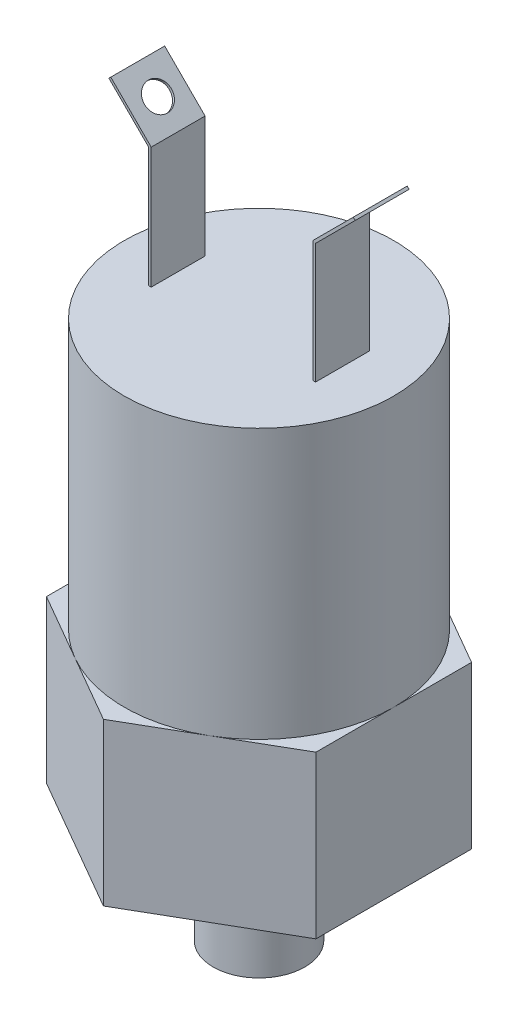
ISO-10303-21;
HEADER;
FILE_DESCRIPTION(('STEP AP214'),'2;1');
FILE_NAME('part.step','',(''),(''),'','','');
FILE_SCHEMA(('AUTOMOTIVE_DESIGN { 1 0 10303 214 1 1 1 1 }'));
ENDSEC;
DATA;
#1=APPLICATION_CONTEXT('core data for automotive mechanical design processes');
#2=APPLICATION_PROTOCOL_DEFINITION('international standard','automotive_design',2000,#1);
#3=PRODUCT_CONTEXT('',#1,'mechanical');
#4=PRODUCT('Part','Part','',(#3));
#5=PRODUCT_RELATED_PRODUCT_CATEGORY('part','',(#4));
#6=PRODUCT_DEFINITION_FORMATION('','',#4);
#7=PRODUCT_DEFINITION_CONTEXT('part definition',#1,'design');
#8=PRODUCT_DEFINITION('design','',#6,#7);
#9=PRODUCT_DEFINITION_SHAPE('','',#8);
#10=(LENGTH_UNIT() NAMED_UNIT(*) SI_UNIT(.MILLI.,.METRE.));
#11=(NAMED_UNIT(*) PLANE_ANGLE_UNIT() SI_UNIT($,.RADIAN.));
#12=(NAMED_UNIT(*) SI_UNIT($,.STERADIAN.) SOLID_ANGLE_UNIT());
#13=UNCERTAINTY_MEASURE_WITH_UNIT(LENGTH_MEASURE(1.E-05),#10,'distance_accuracy_value','');
#14=(GEOMETRIC_REPRESENTATION_CONTEXT(3) GLOBAL_UNCERTAINTY_ASSIGNED_CONTEXT((#13)) GLOBAL_UNIT_ASSIGNED_CONTEXT((#10,
#11,#12)) REPRESENTATION_CONTEXT('',''));
#15=CARTESIAN_POINT('',(0.,0.,0.));
#16=DIRECTION('',(0.,0.,1.));
#17=DIRECTION('',(1.,0.,0.));
#18=AXIS2_PLACEMENT_3D('',#15,#16,#17);
#19=CARTESIAN_POINT('',(0.,50.8,0.));
#20=DIRECTION('',(0.,1.,0.));
#21=DIRECTION('',(0.,0.,1.));
#22=AXIS2_PLACEMENT_3D('',#19,#20,#21);
#23=PLANE('',#22);
#24=CARTESIAN_POINT('',(0.,50.8,0.));
#25=DIRECTION('',(0.,1.,0.));
#26=DIRECTION('',(0.,0.,1.));
#27=AXIS2_PLACEMENT_3D('',#24,#25,#26);
#28=CIRCLE('',#27,12.7);
#29=CARTESIAN_POINT('',(0.,50.8,12.7));
#30=VERTEX_POINT('',#29);
#31=EDGE_CURVE('E374',#30,#30,#28,.T.);
#32=ORIENTED_EDGE('',*,*,#31,.T.);
#33=EDGE_LOOP('',(#32));
#34=FACE_BOUND('',#33,.T.);
#35=DIRECTION('',(0.,0.,-1.));
#36=VECTOR('',#35,1.);
#37=CARTESIAN_POINT('',(7.874,50.8,2.54));
#38=LINE('',#37,#36);
#39=CARTESIAN_POINT('',(7.874,50.8,2.54));
#40=VERTEX_POINT('',#39);
#41=CARTESIAN_POINT('',(7.874,50.8,-2.54));
#42=VERTEX_POINT('',#41);
#43=EDGE_CURVE('E358',#40,#42,#38,.T.);
#44=ORIENTED_EDGE('',*,*,#43,.F.);
#45=DIRECTION('',(-1.,0.,0.));
#46=VECTOR('',#45,1.);
#47=CARTESIAN_POINT('',(7.874,50.8,2.54));
#48=LINE('',#47,#46);
#49=CARTESIAN_POINT('',(7.62,50.8,2.54));
#50=VERTEX_POINT('',#49);
#51=EDGE_CURVE('E327',#40,#50,#48,.T.);
#52=ORIENTED_EDGE('',*,*,#51,.T.);
#53=DIRECTION('',(0.,0.,-1.));
#54=VECTOR('',#53,1.);
#55=CARTESIAN_POINT('',(7.62,50.8,2.54));
#56=LINE('',#55,#54);
#57=CARTESIAN_POINT('',(7.62,50.8,-2.54));
#58=VERTEX_POINT('',#57);
#59=EDGE_CURVE('E362',#50,#58,#56,.T.);
#60=ORIENTED_EDGE('',*,*,#59,.T.);
#61=DIRECTION('',(-1.,0.,0.));
#62=VECTOR('',#61,1.);
#63=CARTESIAN_POINT('',(7.874,50.8,-2.54));
#64=LINE('',#63,#62);
#65=EDGE_CURVE('E349',#42,#58,#64,.T.);
#66=ORIENTED_EDGE('',*,*,#65,.F.);
#67=EDGE_LOOP('',(#44,#52,#60,#66));
#68=FACE_BOUND('',#67,.T.);
#69=DIRECTION('',(0.,0.,-1.));
#70=VECTOR('',#69,1.);
#71=CARTESIAN_POINT('',(-7.62,50.8,2.54));
#72=LINE('',#71,#70);
#73=CARTESIAN_POINT('',(-7.62,50.8,2.54));
#74=VERTEX_POINT('',#73);
#75=CARTESIAN_POINT('',(-7.62,50.8,-2.54));
#76=VERTEX_POINT('',#75);
#77=EDGE_CURVE('E71',#74,#76,#72,.T.);
#78=ORIENTED_EDGE('',*,*,#77,.F.);
#79=DIRECTION('',(1.,0.,0.));
#80=VECTOR('',#79,1.);
#81=CARTESIAN_POINT('',(-7.874,50.8,2.54));
#82=LINE('',#81,#80);
#83=CARTESIAN_POINT('',(-7.874,50.8,2.54));
#84=VERTEX_POINT('',#83);
#85=EDGE_CURVE('E65',#84,#74,#82,.T.);
#86=ORIENTED_EDGE('',*,*,#85,.F.);
#87=DIRECTION('',(0.,0.,-1.));
#88=VECTOR('',#87,1.);
#89=CARTESIAN_POINT('',(-7.874,50.8,2.54));
#90=LINE('',#89,#88);
#91=CARTESIAN_POINT('',(-7.874,50.8,-2.54));
#92=VERTEX_POINT('',#91);
#93=EDGE_CURVE('E242',#84,#92,#90,.T.);
#94=ORIENTED_EDGE('',*,*,#93,.T.);
#95=DIRECTION('',(1.,0.,0.));
#96=VECTOR('',#95,1.);
#97=CARTESIAN_POINT('',(-7.874,50.8,-2.54));
#98=LINE('',#97,#96);
#99=EDGE_CURVE('E277',#92,#76,#98,.T.);
#100=ORIENTED_EDGE('',*,*,#99,.T.);
#101=EDGE_LOOP('',(#78,#86,#94,#100));
#102=FACE_BOUND('',#101,.T.);
#103=ADVANCED_FACE('F43',(#34,#68,#102),#23,.T.);
#104=CARTESIAN_POINT('',(0.,25.4,0.));
#105=DIRECTION('',(0.,1.,0.));
#106=DIRECTION('',(0.,0.,1.));
#107=AXIS2_PLACEMENT_3D('',#104,#105,#106);
#108=PLANE('',#107);
#109=CARTESIAN_POINT('',(0.,25.4,0.));
#110=DIRECTION('',(0.,1.,0.));
#111=DIRECTION('',(0.,0.,1.));
#112=AXIS2_PLACEMENT_3D('',#109,#110,#111);
#113=CIRCLE('',#112,12.7);
#114=CARTESIAN_POINT('',(6.35,25.4,10.9985226280624));
#115=VERTEX_POINT('',#114);
#116=CARTESIAN_POINT('',(12.7,25.4,0.));
#117=VERTEX_POINT('',#116);
#118=EDGE_CURVE('E55',#115,#117,#113,.T.);
#119=ORIENTED_EDGE('',*,*,#118,.F.);
#120=DIRECTION('',(0.866025403784439,0.,-0.5));
#121=VECTOR('',#120,1.);
#122=CARTESIAN_POINT('',(0.,25.4,14.6646968374165));
#123=LINE('',#122,#121);
#124=CARTESIAN_POINT('',(12.7,25.4,7.33234841870824));
#125=VERTEX_POINT('',#124);
#126=EDGE_CURVE('E401',#115,#125,#123,.T.);
#127=ORIENTED_EDGE('',*,*,#126,.T.);
#128=DIRECTION('',(0.,0.,-1.));
#129=VECTOR('',#128,1.);
#130=CARTESIAN_POINT('',(12.7,25.4,7.33234841870824));
#131=LINE('',#130,#129);
#132=EDGE_CURVE('E406',#125,#117,#131,.T.);
#133=ORIENTED_EDGE('',*,*,#132,.T.);
#134=EDGE_LOOP('',(#119,#127,#133));
#135=FACE_BOUND('',#134,.T.);
#136=ADVANCED_FACE('F477',(#135),#108,.T.);
#137=CARTESIAN_POINT('',(6.35,25.4,-10.9985226280624));
#138=VERTEX_POINT('',#137);
#139=EDGE_CURVE('E11',#117,#138,#113,.T.);
#140=ORIENTED_EDGE('',*,*,#139,.F.);
#141=CARTESIAN_POINT('',(12.7,25.4,-7.33234841870825));
#142=VERTEX_POINT('',#141);
#143=EDGE_CURVE('E405',#117,#142,#131,.T.);
#144=ORIENTED_EDGE('',*,*,#143,.T.);
#145=DIRECTION('',(-0.866025403784439,0.,-0.5));
#146=VECTOR('',#145,1.);
#147=CARTESIAN_POINT('',(12.7,25.4,-7.33234841870825));
#148=LINE('',#147,#146);
#149=EDGE_CURVE('E381',#142,#138,#148,.T.);
#150=ORIENTED_EDGE('',*,*,#149,.T.);
#151=EDGE_LOOP('',(#140,#144,#150));
#152=FACE_BOUND('',#151,.T.);
#153=ADVANCED_FACE('F483',(#152),#108,.T.);
#154=CARTESIAN_POINT('',(-6.35,25.4,-10.9985226280624));
#155=VERTEX_POINT('',#154);
#156=EDGE_CURVE('E53',#138,#155,#113,.T.);
#157=ORIENTED_EDGE('',*,*,#156,.F.);
#158=CARTESIAN_POINT('',(0.,25.4,-14.6646968374165));
#159=VERTEX_POINT('',#158);
#160=EDGE_CURVE('E386',#138,#159,#148,.T.);
#161=ORIENTED_EDGE('',*,*,#160,.T.);
#162=DIRECTION('',(-0.866025403784438,0.,0.5));
#163=VECTOR('',#162,1.);
#164=CARTESIAN_POINT('',(0.,25.4,-14.6646968374165));
#165=LINE('',#164,#163);
#166=EDGE_CURVE('E387',#159,#155,#165,.T.);
#167=ORIENTED_EDGE('',*,*,#166,.T.);
#168=EDGE_LOOP('',(#157,#161,#167));
#169=FACE_BOUND('',#168,.T.);
#170=ADVANCED_FACE('F551',(#169),#108,.T.);
#171=CARTESIAN_POINT('',(-12.7,25.4,0.));
#172=VERTEX_POINT('',#171);
#173=EDGE_CURVE('E543',#155,#172,#113,.T.);
#174=ORIENTED_EDGE('',*,*,#173,.F.);
#175=CARTESIAN_POINT('',(-12.7,25.4,-7.33234841870824));
#176=VERTEX_POINT('',#175);
#177=EDGE_CURVE('E385',#155,#176,#165,.T.);
#178=ORIENTED_EDGE('',*,*,#177,.T.);
#179=DIRECTION('',(0.,0.,1.));
#180=VECTOR('',#179,1.);
#181=CARTESIAN_POINT('',(-12.7,25.4,-7.33234841870824));
#182=LINE('',#181,#180);
#183=EDGE_CURVE('E392',#176,#172,#182,.T.);
#184=ORIENTED_EDGE('',*,*,#183,.T.);
#185=EDGE_LOOP('',(#174,#178,#184));
#186=FACE_BOUND('',#185,.T.);
#187=ADVANCED_FACE('F562',(#186),#108,.T.);
#188=CARTESIAN_POINT('',(-6.35,25.4,10.9985226280624));
#189=VERTEX_POINT('',#188);
#190=EDGE_CURVE('E458',#172,#189,#113,.T.);
#191=ORIENTED_EDGE('',*,*,#190,.F.);
#192=CARTESIAN_POINT('',(-12.7,25.4,7.33234841870825));
#193=VERTEX_POINT('',#192);
#194=EDGE_CURVE('E391',#172,#193,#182,.T.);
#195=ORIENTED_EDGE('',*,*,#194,.T.);
#196=DIRECTION('',(0.866025403784439,0.,0.5));
#197=VECTOR('',#196,1.);
#198=CARTESIAN_POINT('',(-12.7,25.4,7.33234841870825));
#199=LINE('',#198,#197);
#200=EDGE_CURVE('E397',#193,#189,#199,.T.);
#201=ORIENTED_EDGE('',*,*,#200,.T.);
#202=EDGE_LOOP('',(#191,#195,#201));
#203=FACE_BOUND('',#202,.T.);
#204=ADVANCED_FACE('F474',(#203),#108,.T.);
#205=CARTESIAN_POINT('',(0.,10.16,0.));
#206=DIRECTION('',(0.,-1.,0.));
#207=DIRECTION('',(0.,0.,-1.));
#208=AXIS2_PLACEMENT_3D('',#205,#206,#207);
#209=CYLINDRICAL_SURFACE('',#208,4.318);
#210=CARTESIAN_POINT('',(0.,10.16,0.));
#211=DIRECTION('',(0.,1.,0.));
#212=DIRECTION('',(0.,0.,1.));
#213=AXIS2_PLACEMENT_3D('',#210,#211,#212);
#214=CIRCLE('',#213,4.318);
#215=CARTESIAN_POINT('',(0.,10.16,4.318));
#216=VERTEX_POINT('',#215);
#217=EDGE_CURVE('E451',#216,#216,#214,.T.);
#218=ORIENTED_EDGE('',*,*,#217,.F.);
#219=EDGE_LOOP('',(#218));
#220=FACE_BOUND('',#219,.T.);
#221=CARTESIAN_POINT('',(0.,0.,0.));
#222=DIRECTION('',(0.,1.,0.));
#223=DIRECTION('',(0.,0.,1.));
#224=AXIS2_PLACEMENT_3D('',#221,#222,#223);
#225=CIRCLE('',#224,4.318);
#226=CARTESIAN_POINT('',(0.,0.,4.318));
#227=VERTEX_POINT('',#226);
#228=EDGE_CURVE('E47',#227,#227,#225,.T.);
#229=ORIENTED_EDGE('',*,*,#228,.T.);
#230=EDGE_LOOP('',(#229));
#231=FACE_BOUND('',#230,.T.);
#232=ADVANCED_FACE('F45',(#220,#231),#209,.T.);
#233=CARTESIAN_POINT('',(0.,0.,0.));
#234=DIRECTION('',(0.,1.,0.));
#235=DIRECTION('',(0.,0.,1.));
#236=AXIS2_PLACEMENT_3D('',#233,#234,#235);
#237=PLANE('',#236);
#238=ORIENTED_EDGE('',*,*,#228,.F.);
#239=EDGE_LOOP('',(#238));
#240=FACE_BOUND('',#239,.T.);
#241=ADVANCED_FACE('F464',(#240),#237,.F.);
#242=CARTESIAN_POINT('',(12.7,25.4,-7.33234841870825));
#243=DIRECTION('',(-0.5,0.,0.866025403784439));
#244=DIRECTION('',(0.866025403784439,0.,0.5));
#245=AXIS2_PLACEMENT_3D('',#242,#243,#244);
#246=PLANE('',#245);
#247=DIRECTION('',(-0.866025403784439,0.,-0.5));
#248=VECTOR('',#247,1.);
#249=CARTESIAN_POINT('',(12.7,10.16,-7.33234841870825));
#250=LINE('',#249,#248);
#251=CARTESIAN_POINT('',(12.7,10.16,-7.33234841870825));
#252=VERTEX_POINT('',#251);
#253=CARTESIAN_POINT('',(0.,10.16,-14.6646968374165));
#254=VERTEX_POINT('',#253);
#255=EDGE_CURVE('E376',#252,#254,#250,.T.);
#256=ORIENTED_EDGE('',*,*,#255,.T.);
#257=DIRECTION('',(0.,-1.,0.));
#258=VECTOR('',#257,1.);
#259=CARTESIAN_POINT('',(0.,25.4,-14.6646968374165));
#260=LINE('',#259,#258);
#261=EDGE_CURVE('E448',#159,#254,#260,.T.);
#262=ORIENTED_EDGE('',*,*,#261,.F.);
#263=ORIENTED_EDGE('',*,*,#160,.F.);
#264=ORIENTED_EDGE('',*,*,#149,.F.);
#265=DIRECTION('',(0.,-1.,0.));
#266=VECTOR('',#265,1.);
#267=CARTESIAN_POINT('',(12.7,25.4,-7.33234841870825));
#268=LINE('',#267,#266);
#269=EDGE_CURVE('E410',#142,#252,#268,.T.);
#270=ORIENTED_EDGE('',*,*,#269,.T.);
#271=EDGE_LOOP('',(#256,#262,#263,#264,#270));
#272=FACE_BOUND('',#271,.T.);
#273=ADVANCED_FACE('F466',(#272),#246,.F.);
#274=CARTESIAN_POINT('',(0.,25.4,-14.6646968374165));
#275=DIRECTION('',(0.5,0.,0.866025403784438));
#276=DIRECTION('',(0.866025403784439,0.,-0.5));
#277=AXIS2_PLACEMENT_3D('',#274,#275,#276);
#278=PLANE('',#277);
#279=DIRECTION('',(-0.866025403784438,0.,0.5));
#280=VECTOR('',#279,1.);
#281=CARTESIAN_POINT('',(0.,10.16,-14.6646968374165));
#282=LINE('',#281,#280);
#283=CARTESIAN_POINT('',(-12.7,10.16,-7.33234841870824));
#284=VERTEX_POINT('',#283);
#285=EDGE_CURVE('E414',#254,#284,#282,.T.);
#286=ORIENTED_EDGE('',*,*,#285,.T.);
#287=DIRECTION('',(0.,-1.,0.));
#288=VECTOR('',#287,1.);
#289=CARTESIAN_POINT('',(-12.7,25.4,-7.33234841870824));
#290=LINE('',#289,#288);
#291=EDGE_CURVE('E444',#176,#284,#290,.T.);
#292=ORIENTED_EDGE('',*,*,#291,.F.);
#293=ORIENTED_EDGE('',*,*,#177,.F.);
#294=ORIENTED_EDGE('',*,*,#166,.F.);
#295=ORIENTED_EDGE('',*,*,#261,.T.);
#296=EDGE_LOOP('',(#286,#292,#293,#294,#295));
#297=FACE_BOUND('',#296,.T.);
#298=ADVANCED_FACE('F471',(#297),#278,.F.);
#299=CARTESIAN_POINT('',(-12.7,25.4,-7.33234841870824));
#300=DIRECTION('',(1.,0.,0.));
#301=DIRECTION('',(0.,0.,-1.));
#302=AXIS2_PLACEMENT_3D('',#299,#300,#301);
#303=PLANE('',#302);
#304=DIRECTION('',(0.,0.,1.));
#305=VECTOR('',#304,1.);
#306=CARTESIAN_POINT('',(-12.7,10.16,-7.33234841870824));
#307=LINE('',#306,#305);
#308=CARTESIAN_POINT('',(-12.7,10.16,7.33234841870825));
#309=VERTEX_POINT('',#308);
#310=EDGE_CURVE('E417',#284,#309,#307,.T.);
#311=ORIENTED_EDGE('',*,*,#310,.T.);
#312=DIRECTION('',(0.,-1.,0.));
#313=VECTOR('',#312,1.);
#314=CARTESIAN_POINT('',(-12.7,25.4,7.33234841870825));
#315=LINE('',#314,#313);
#316=EDGE_CURVE('E440',#193,#309,#315,.T.);
#317=ORIENTED_EDGE('',*,*,#316,.F.);
#318=ORIENTED_EDGE('',*,*,#194,.F.);
#319=ORIENTED_EDGE('',*,*,#183,.F.);
#320=ORIENTED_EDGE('',*,*,#291,.T.);
#321=EDGE_LOOP('',(#311,#317,#318,#319,#320));
#322=FACE_BOUND('',#321,.T.);
#323=ADVANCED_FACE('F512',(#322),#303,.F.);
#324=CARTESIAN_POINT('',(-12.7,25.4,7.33234841870825));
#325=DIRECTION('',(0.5,0.,-0.866025403784439));
#326=DIRECTION('',(-0.866025403784439,0.,-0.5));
#327=AXIS2_PLACEMENT_3D('',#324,#325,#326);
#328=PLANE('',#327);
#329=DIRECTION('',(0.866025403784439,0.,0.5));
#330=VECTOR('',#329,1.);
#331=CARTESIAN_POINT('',(-12.7,10.16,7.33234841870825));
#332=LINE('',#331,#330);
#333=CARTESIAN_POINT('',(0.,10.16,14.6646968374165));
#334=VERTEX_POINT('',#333);
#335=EDGE_CURVE('E420',#309,#334,#332,.T.);
#336=ORIENTED_EDGE('',*,*,#335,.T.);
#337=DIRECTION('',(0.,-1.,0.));
#338=VECTOR('',#337,1.);
#339=CARTESIAN_POINT('',(0.,25.4,14.6646968374165));
#340=LINE('',#339,#338);
#341=CARTESIAN_POINT('',(0.,25.4,14.6646968374165));
#342=VERTEX_POINT('',#341);
#343=EDGE_CURVE('E436',#342,#334,#340,.T.);
#344=ORIENTED_EDGE('',*,*,#343,.F.);
#345=EDGE_CURVE('E396',#189,#342,#199,.T.);
#346=ORIENTED_EDGE('',*,*,#345,.F.);
#347=ORIENTED_EDGE('',*,*,#200,.F.);
#348=ORIENTED_EDGE('',*,*,#316,.T.);
#349=EDGE_LOOP('',(#336,#344,#346,#347,#348));
#350=FACE_BOUND('',#349,.T.);
#351=ADVANCED_FACE('F508',(#350),#328,.F.);
#352=CARTESIAN_POINT('',(0.,25.4,14.6646968374165));
#353=DIRECTION('',(-0.5,0.,-0.866025403784439));
#354=DIRECTION('',(-0.866025403784439,0.,0.5));
#355=AXIS2_PLACEMENT_3D('',#352,#353,#354);
#356=PLANE('',#355);
#357=DIRECTION('',(0.866025403784439,0.,-0.5));
#358=VECTOR('',#357,1.);
#359=CARTESIAN_POINT('',(0.,10.16,14.6646968374165));
#360=LINE('',#359,#358);
#361=CARTESIAN_POINT('',(12.7,10.16,7.33234841870824));
#362=VERTEX_POINT('',#361);
#363=EDGE_CURVE('E423',#334,#362,#360,.T.);
#364=ORIENTED_EDGE('',*,*,#363,.T.);
#365=DIRECTION('',(0.,-1.,0.));
#366=VECTOR('',#365,1.);
#367=CARTESIAN_POINT('',(12.7,25.4,7.33234841870824));
#368=LINE('',#367,#366);
#369=EDGE_CURVE('E432',#125,#362,#368,.T.);
#370=ORIENTED_EDGE('',*,*,#369,.F.);
#371=ORIENTED_EDGE('',*,*,#126,.F.);
#372=EDGE_CURVE('E402',#342,#115,#123,.T.);
#373=ORIENTED_EDGE('',*,*,#372,.F.);
#374=ORIENTED_EDGE('',*,*,#343,.T.);
#375=EDGE_LOOP('',(#364,#370,#371,#373,#374));
#376=FACE_BOUND('',#375,.T.);
#377=ADVANCED_FACE('F504',(#376),#356,.F.);
#378=CARTESIAN_POINT('',(12.7,25.4,7.33234841870824));
#379=DIRECTION('',(-1.,0.,0.));
#380=DIRECTION('',(0.,0.,1.));
#381=AXIS2_PLACEMENT_3D('',#378,#379,#380);
#382=PLANE('',#381);
#383=DIRECTION('',(0.,0.,-1.));
#384=VECTOR('',#383,1.);
#385=CARTESIAN_POINT('',(12.7,10.16,7.33234841870824));
#386=LINE('',#385,#384);
#387=EDGE_CURVE('E426',#362,#252,#386,.T.);
#388=ORIENTED_EDGE('',*,*,#387,.T.);
#389=ORIENTED_EDGE('',*,*,#269,.F.);
#390=ORIENTED_EDGE('',*,*,#143,.F.);
#391=ORIENTED_EDGE('',*,*,#132,.F.);
#392=ORIENTED_EDGE('',*,*,#369,.T.);
#393=EDGE_LOOP('',(#388,#389,#390,#391,#392));
#394=FACE_BOUND('',#393,.T.);
#395=ADVANCED_FACE('F498',(#394),#382,.F.);
#396=EDGE_CURVE('E380',#189,#115,#113,.T.);
#397=ORIENTED_EDGE('',*,*,#396,.F.);
#398=ORIENTED_EDGE('',*,*,#345,.T.);
#399=ORIENTED_EDGE('',*,*,#372,.T.);
#400=EDGE_LOOP('',(#397,#398,#399));
#401=FACE_BOUND('',#400,.T.);
#402=ADVANCED_FACE('F486',(#401),#108,.T.);
#403=CARTESIAN_POINT('',(0.,10.16,0.));
#404=DIRECTION('',(0.,1.,0.));
#405=DIRECTION('',(0.,0.,1.));
#406=AXIS2_PLACEMENT_3D('',#403,#404,#405);
#407=PLANE('',#406);
#408=ORIENTED_EDGE('',*,*,#217,.T.);
#409=EDGE_LOOP('',(#408));
#410=FACE_BOUND('',#409,.T.);
#411=ORIENTED_EDGE('',*,*,#255,.F.);
#412=ORIENTED_EDGE('',*,*,#387,.F.);
#413=ORIENTED_EDGE('',*,*,#363,.F.);
#414=ORIENTED_EDGE('',*,*,#335,.F.);
#415=ORIENTED_EDGE('',*,*,#310,.F.);
#416=ORIENTED_EDGE('',*,*,#285,.F.);
#417=EDGE_LOOP('',(#411,#412,#413,#414,#415,#416));
#418=FACE_BOUND('',#417,.T.);
#419=ADVANCED_FACE('F494',(#410,#418),#407,.F.);
#420=CARTESIAN_POINT('',(0.,50.8,0.));
#421=DIRECTION('',(0.,-1.,0.));
#422=DIRECTION('',(0.,0.,-1.));
#423=AXIS2_PLACEMENT_3D('',#420,#421,#422);
#424=CYLINDRICAL_SURFACE('',#423,12.7);
#425=ORIENTED_EDGE('',*,*,#31,.F.);
#426=EDGE_LOOP('',(#425));
#427=FACE_BOUND('',#426,.T.);
#428=ORIENTED_EDGE('',*,*,#118,.T.);
#429=ORIENTED_EDGE('',*,*,#139,.T.);
#430=ORIENTED_EDGE('',*,*,#156,.T.);
#431=ORIENTED_EDGE('',*,*,#173,.T.);
#432=ORIENTED_EDGE('',*,*,#190,.T.);
#433=ORIENTED_EDGE('',*,*,#396,.T.);
#434=EDGE_LOOP('',(#428,#429,#430,#431,#432,#433));
#435=FACE_BOUND('',#434,.T.);
#436=ADVANCED_FACE('F492',(#427,#435),#424,.T.);
#437=CARTESIAN_POINT('',(7.79960512242138,62.0503948775786,2.54));
#438=DIRECTION('',(-0.707106781186545,0.70710678118655,0.));
#439=DIRECTION('',(-0.70710678118655,-0.707106781186545,0.));
#440=AXIS2_PLACEMENT_3D('',#437,#438,#439);
#441=PLANE('',#440);
#442=CARTESIAN_POINT('',(9.70460512242139,63.9553948775786,0.));
#443=DIRECTION('',(-0.707106781186545,0.70710678118655,0.));
#444=DIRECTION('',(-0.70710678118655,-0.707106781186545,0.));
#445=AXIS2_PLACEMENT_3D('',#442,#443,#444);
#446=CIRCLE('',#445,1.27);
#447=CARTESIAN_POINT('',(8.80657951031448,63.0573692654717,0.));
#448=VERTEX_POINT('',#447);
#449=EDGE_CURVE('E306',#448,#448,#446,.F.);
#450=ORIENTED_EDGE('',*,*,#449,.F.);
#451=EDGE_LOOP('',(#450));
#452=FACE_BOUND('',#451,.T.);
#453=DIRECTION('',(0.70710678118655,0.707106781186545,0.));
#454=VECTOR('',#453,1.);
#455=CARTESIAN_POINT('',(7.79960512242138,62.0503948775786,-2.54));
#456=LINE('',#455,#454);
#457=CARTESIAN_POINT('',(7.874,62.1247897551572,-2.54));
#458=VERTEX_POINT('',#457);
#459=CARTESIAN_POINT('',(11.6096051224214,65.8603948775786,-2.54));
#460=VERTEX_POINT('',#459);
#461=EDGE_CURVE('E310',#458,#460,#456,.T.);
#462=ORIENTED_EDGE('',*,*,#461,.T.);
#463=DIRECTION('',(0.,0.,-1.));
#464=VECTOR('',#463,1.);
#465=CARTESIAN_POINT('',(11.6096051224214,65.8603948775786,2.54));
#466=LINE('',#465,#464);
#467=CARTESIAN_POINT('',(11.6096051224214,65.8603948775786,2.54));
#468=VERTEX_POINT('',#467);
#469=EDGE_CURVE('E371',#468,#460,#466,.T.);
#470=ORIENTED_EDGE('',*,*,#469,.F.);
#471=DIRECTION('',(0.70710678118655,0.707106781186545,0.));
#472=VECTOR('',#471,1.);
#473=CARTESIAN_POINT('',(7.79960512242138,62.0503948775786,2.54));
#474=LINE('',#473,#472);
#475=CARTESIAN_POINT('',(7.874,62.1247897551572,2.54));
#476=VERTEX_POINT('',#475);
#477=EDGE_CURVE('E311',#476,#468,#474,.T.);
#478=ORIENTED_EDGE('',*,*,#477,.F.);
#479=DIRECTION('',(0.,0.,-1.));
#480=VECTOR('',#479,1.);
#481=CARTESIAN_POINT('',(7.874,62.1247897551572,2.54));
#482=LINE('',#481,#480);
#483=EDGE_CURVE('E333',#476,#458,#482,.T.);
#484=ORIENTED_EDGE('',*,*,#483,.T.);
#485=EDGE_LOOP('',(#462,#470,#478,#484));
#486=FACE_BOUND('',#485,.T.);
#487=ADVANCED_FACE('F490',(#452,#486),#441,.F.);
#488=CARTESIAN_POINT('',(11.43,66.04,2.54));
#489=DIRECTION('',(0.707106781186537,0.707106781186558,0.));
#490=DIRECTION('',(-0.707106781186558,0.707106781186537,0.));
#491=AXIS2_PLACEMENT_3D('',#488,#489,#490);
#492=PLANE('',#491);
#493=DIRECTION('',(0.707106781186558,-0.707106781186537,0.));
#494=VECTOR('',#493,1.);
#495=CARTESIAN_POINT('',(11.43,66.04,-2.54));
#496=LINE('',#495,#494);
#497=CARTESIAN_POINT('',(11.43,66.04,-2.54));
#498=VERTEX_POINT('',#497);
#499=EDGE_CURVE('E337',#498,#460,#496,.T.);
#500=ORIENTED_EDGE('',*,*,#499,.F.);
#501=DIRECTION('',(0.,0.,-1.));
#502=VECTOR('',#501,1.);
#503=CARTESIAN_POINT('',(11.43,66.04,2.54));
#504=LINE('',#503,#502);
#505=CARTESIAN_POINT('',(11.43,66.04,2.54));
#506=VERTEX_POINT('',#505);
#507=EDGE_CURVE('E368',#506,#498,#504,.T.);
#508=ORIENTED_EDGE('',*,*,#507,.F.);
#509=DIRECTION('',(0.707106781186558,-0.707106781186537,0.));
#510=VECTOR('',#509,1.);
#511=CARTESIAN_POINT('',(11.43,66.04,2.54));
#512=LINE('',#511,#510);
#513=EDGE_CURVE('E314',#506,#468,#512,.T.);
#514=ORIENTED_EDGE('',*,*,#513,.T.);
#515=ORIENTED_EDGE('',*,*,#469,.T.);
#516=EDGE_LOOP('',(#500,#508,#514,#515));
#517=FACE_BOUND('',#516,.T.);
#518=ADVANCED_FACE('F714',(#517),#492,.T.);
#519=CARTESIAN_POINT('',(7.62,62.23,2.54));
#520=DIRECTION('',(-0.707106781186545,0.70710678118655,0.));
#521=DIRECTION('',(-0.70710678118655,-0.707106781186545,0.));
#522=AXIS2_PLACEMENT_3D('',#519,#520,#521);
#523=PLANE('',#522);
#524=CARTESIAN_POINT('',(9.525,64.135,0.));
#525=DIRECTION('',(-0.707106781186545,0.70710678118655,0.));
#526=DIRECTION('',(-0.70710678118655,-0.707106781186545,0.));
#527=AXIS2_PLACEMENT_3D('',#524,#525,#526);
#528=CIRCLE('',#527,1.27);
#529=CARTESIAN_POINT('',(8.62697438789307,63.2369743878931,0.));
#530=VERTEX_POINT('',#529);
#531=EDGE_CURVE('E241',#530,#530,#528,.T.);
#532=ORIENTED_EDGE('',*,*,#531,.F.);
#533=EDGE_LOOP('',(#532));
#534=FACE_BOUND('',#533,.T.);
#535=DIRECTION('',(0.70710678118655,0.707106781186545,0.));
#536=VECTOR('',#535,1.);
#537=CARTESIAN_POINT('',(7.62,62.23,-2.54));
#538=LINE('',#537,#536);
#539=CARTESIAN_POINT('',(7.62,62.23,-2.54));
#540=VERTEX_POINT('',#539);
#541=EDGE_CURVE('E341',#540,#498,#538,.T.);
#542=ORIENTED_EDGE('',*,*,#541,.F.);
#543=DIRECTION('',(0.,0.,-1.));
#544=VECTOR('',#543,1.);
#545=CARTESIAN_POINT('',(7.62,62.23,2.54));
#546=LINE('',#545,#544);
#547=CARTESIAN_POINT('',(7.62,62.23,2.54));
#548=VERTEX_POINT('',#547);
#549=EDGE_CURVE('E365',#548,#540,#546,.T.);
#550=ORIENTED_EDGE('',*,*,#549,.F.);
#551=DIRECTION('',(0.70710678118655,0.707106781186545,0.));
#552=VECTOR('',#551,1.);
#553=CARTESIAN_POINT('',(7.62,62.23,2.54));
#554=LINE('',#553,#552);
#555=EDGE_CURVE('E319',#548,#506,#554,.T.);
#556=ORIENTED_EDGE('',*,*,#555,.T.);
#557=ORIENTED_EDGE('',*,*,#507,.T.);
#558=EDGE_LOOP('',(#542,#550,#556,#557));
#559=FACE_BOUND('',#558,.T.);
#560=ADVANCED_FACE('F711',(#534,#559),#523,.T.);
#561=CARTESIAN_POINT('',(7.62,50.8,2.54));
#562=DIRECTION('',(-1.,0.,0.));
#563=DIRECTION('',(0.,-1.,0.));
#564=AXIS2_PLACEMENT_3D('',#561,#562,#563);
#565=PLANE('',#564);
#566=DIRECTION('',(0.,1.,0.));
#567=VECTOR('',#566,1.);
#568=CARTESIAN_POINT('',(7.62,50.8,-2.54));
#569=LINE('',#568,#567);
#570=EDGE_CURVE('E345',#58,#540,#569,.T.);
#571=ORIENTED_EDGE('',*,*,#570,.F.);
#572=ORIENTED_EDGE('',*,*,#59,.F.);
#573=DIRECTION('',(0.,1.,0.));
#574=VECTOR('',#573,1.);
#575=CARTESIAN_POINT('',(7.62,50.8,2.54));
#576=LINE('',#575,#574);
#577=EDGE_CURVE('E323',#50,#548,#576,.T.);
#578=ORIENTED_EDGE('',*,*,#577,.T.);
#579=ORIENTED_EDGE('',*,*,#549,.T.);
#580=EDGE_LOOP('',(#571,#572,#578,#579));
#581=FACE_BOUND('',#580,.T.);
#582=ADVANCED_FACE('F707',(#581),#565,.T.);
#583=CARTESIAN_POINT('',(7.874,50.8,2.54));
#584=DIRECTION('',(-1.,0.,0.));
#585=DIRECTION('',(0.,-1.,0.));
#586=AXIS2_PLACEMENT_3D('',#583,#584,#585);
#587=PLANE('',#586);
#588=DIRECTION('',(0.,1.,0.));
#589=VECTOR('',#588,1.);
#590=CARTESIAN_POINT('',(7.874,50.8,-2.54));
#591=LINE('',#590,#589);
#592=EDGE_CURVE('E315',#42,#458,#591,.T.);
#593=ORIENTED_EDGE('',*,*,#592,.T.);
#594=ORIENTED_EDGE('',*,*,#483,.F.);
#595=DIRECTION('',(0.,1.,0.));
#596=VECTOR('',#595,1.);
#597=CARTESIAN_POINT('',(7.874,50.8,2.54));
#598=LINE('',#597,#596);
#599=EDGE_CURVE('E330',#40,#476,#598,.T.);
#600=ORIENTED_EDGE('',*,*,#599,.F.);
#601=ORIENTED_EDGE('',*,*,#43,.T.);
#602=EDGE_LOOP('',(#593,#594,#600,#601));
#603=FACE_BOUND('',#602,.T.);
#604=ADVANCED_FACE('F700',(#603),#587,.F.);
#605=CARTESIAN_POINT('',(0.,0.,2.54));
#606=DIRECTION('',(0.,0.,-1.));
#607=DIRECTION('',(-1.,0.,0.));
#608=AXIS2_PLACEMENT_3D('',#605,#606,#607);
#609=PLANE('',#608);
#610=ORIENTED_EDGE('',*,*,#477,.T.);
#611=ORIENTED_EDGE('',*,*,#513,.F.);
#612=ORIENTED_EDGE('',*,*,#555,.F.);
#613=ORIENTED_EDGE('',*,*,#577,.F.);
#614=ORIENTED_EDGE('',*,*,#51,.F.);
#615=ORIENTED_EDGE('',*,*,#599,.T.);
#616=EDGE_LOOP('',(#610,#611,#612,#613,#614,#615));
#617=FACE_BOUND('',#616,.T.);
#618=ADVANCED_FACE('F697',(#617),#609,.F.);
#619=CARTESIAN_POINT('',(0.,0.,-2.54));
#620=DIRECTION('',(0.,0.,-1.));
#621=DIRECTION('',(-1.,0.,0.));
#622=AXIS2_PLACEMENT_3D('',#619,#620,#621);
#623=PLANE('',#622);
#624=ORIENTED_EDGE('',*,*,#461,.F.);
#625=ORIENTED_EDGE('',*,*,#592,.F.);
#626=ORIENTED_EDGE('',*,*,#65,.T.);
#627=ORIENTED_EDGE('',*,*,#570,.T.);
#628=ORIENTED_EDGE('',*,*,#541,.T.);
#629=ORIENTED_EDGE('',*,*,#499,.T.);
#630=EDGE_LOOP('',(#624,#625,#626,#627,#628,#629));
#631=FACE_BOUND('',#630,.T.);
#632=ADVANCED_FACE('F695',(#631),#623,.T.);
#633=CARTESIAN_POINT('',(43.181,30.4789999999998,0.));
#634=DIRECTION('',(-0.707106781186545,0.70710678118655,0.));
#635=DIRECTION('',(-0.70710678118655,-0.707106781186545,0.));
#636=AXIS2_PLACEMENT_3D('',#633,#634,#635);
#637=CYLINDRICAL_SURFACE('',#636,1.27);
#638=CARTESIAN_POINT('',(8.62697438789307,63.2369743878931,0.));
#639=CARTESIAN_POINT('',(8.62884527458496,63.2351035012012,0.));
#640=CARTESIAN_POINT('',(8.63071616127686,63.2332326145093,0.));
#641=CARTESIAN_POINT('',(8.63445793466063,63.2294908411255,0.));
#642=CARTESIAN_POINT('',(8.63632882135252,63.2276199544336,0.));
#643=CARTESIAN_POINT('',(8.6400705947363,63.2238781810499,0.));
#644=CARTESIAN_POINT('',(8.64194148142819,63.222007294358,0.));
#645=CARTESIAN_POINT('',(8.64568325481197,63.2182655209742,0.));
#646=CARTESIAN_POINT('',(8.64755414150386,63.2163946342823,0.));
#647=CARTESIAN_POINT('',(8.65129591488764,63.2126528608985,0.));
#648=CARTESIAN_POINT('',(8.65316680157953,63.2107819742066,0.));
#649=CARTESIAN_POINT('',(8.65690857496331,63.2070402008229,0.));
#650=CARTESIAN_POINT('',(8.6587794616552,63.205169314131,0.));
#651=CARTESIAN_POINT('',(8.66252123503898,63.2014275407472,0.));
#652=CARTESIAN_POINT('',(8.66439212173087,63.1995566540553,0.));
#653=CARTESIAN_POINT('',(8.66813389511465,63.1958148806715,0.));
#654=CARTESIAN_POINT('',(8.67000478180654,63.1939439939796,0.));
#655=CARTESIAN_POINT('',(8.67374655519031,63.1902022205959,0.));
#656=CARTESIAN_POINT('',(8.6756174418822,63.188331333904,0.));
#657=CARTESIAN_POINT('',(8.67935921526598,63.1845895605202,0.));
#658=CARTESIAN_POINT('',(8.68123010195788,63.1827186738283,0.));
#659=CARTESIAN_POINT('',(8.68497187534166,63.1789769004445,0.));
#660=CARTESIAN_POINT('',(8.68684276203354,63.1771060137526,0.));
#661=CARTESIAN_POINT('',(8.69058453541732,63.1733642403688,0.));
#662=CARTESIAN_POINT('',(8.69245542210922,63.171493353677,0.));
#663=CARTESIAN_POINT('',(8.69619719549299,63.1677515802932,0.));
#664=CARTESIAN_POINT('',(8.69806808218488,63.1658806936013,0.));
#665=CARTESIAN_POINT('',(8.70180985556866,63.1621389202175,0.));
#666=CARTESIAN_POINT('',(8.70368074226055,63.1602680335256,0.));
#667=CARTESIAN_POINT('',(8.70742251564433,63.1565262601418,0.));
#668=CARTESIAN_POINT('',(8.70929340233622,63.15465537345,0.));
#669=CARTESIAN_POINT('',(8.71303517572,63.1509136000662,0.));
#670=CARTESIAN_POINT('',(8.71490606241189,63.1490427133743,0.));
#671=CARTESIAN_POINT('',(8.71864783579567,63.1453009399905,0.));
#672=CARTESIAN_POINT('',(8.72051872248755,63.1434300532986,0.));
#673=CARTESIAN_POINT('',(8.72426049587133,63.1396882799148,0.));
#674=CARTESIAN_POINT('',(8.72613138256323,63.137817393223,0.));
#675=CARTESIAN_POINT('',(8.72987315594701,63.1340756198392,0.));
#676=CARTESIAN_POINT('',(8.7317440426389,63.1322047331473,0.));
#677=CARTESIAN_POINT('',(8.73548581602268,63.1284629597635,0.));
#678=CARTESIAN_POINT('',(8.73735670271457,63.1265920730716,0.));
#679=CARTESIAN_POINT('',(8.74109847609834,63.1228502996878,0.));
#680=CARTESIAN_POINT('',(8.74296936279023,63.1209794129959,0.));
#681=CARTESIAN_POINT('',(8.74671113617401,63.1172376396122,0.));
#682=CARTESIAN_POINT('',(8.7485820228659,63.1153667529203,0.));
#683=CARTESIAN_POINT('',(8.75232379624968,63.1116249795365,0.));
#684=CARTESIAN_POINT('',(8.75419468294157,63.1097540928446,0.));
#685=CARTESIAN_POINT('',(8.75793645632535,63.1060123194608,0.));
#686=CARTESIAN_POINT('',(8.75980734301724,63.1041414327689,0.));
#687=CARTESIAN_POINT('',(8.76354911640102,63.1003996593851,0.));
#688=CARTESIAN_POINT('',(8.76542000309291,63.0985287726933,0.));
#689=CARTESIAN_POINT('',(8.76916177647669,63.0947869993095,0.));
#690=CARTESIAN_POINT('',(8.77103266316858,63.0929161126176,0.));
#691=CARTESIAN_POINT('',(8.77477443655236,63.0891743392338,0.));
#692=CARTESIAN_POINT('',(8.77664532324425,63.0873034525419,0.));
#693=CARTESIAN_POINT('',(8.78038709662803,63.0835616791581,0.));
#694=CARTESIAN_POINT('',(8.78225798331992,63.0816907924662,0.));
#695=CARTESIAN_POINT('',(8.78599975670369,63.0779490190825,0.));
#696=CARTESIAN_POINT('',(8.78787064339558,63.0760781323906,0.));
#697=CARTESIAN_POINT('',(8.79161241677937,63.0723363590068,0.));
#698=CARTESIAN_POINT('',(8.79348330347126,63.0704654723149,0.));
#699=CARTESIAN_POINT('',(8.79722507685504,63.0667236989311,0.));
#700=CARTESIAN_POINT('',(8.79909596354692,63.0648528122392,0.));
#701=CARTESIAN_POINT('',(8.8028377369307,63.0611110388555,0.));
#702=CARTESIAN_POINT('',(8.80470862362259,63.0592401521636,0.));
#703=CARTESIAN_POINT('',(8.80657951031448,63.0573692654717,0.));
#704=B_SPLINE_CURVE_WITH_KNOTS('',3,(#638,#639,#640,#641,#642,#643,#644,#645,#646,#647,#648,
#649,#650,#651,#652,#653,#654,#655,#656,#657,#658,#659,#660,#661,#662,#663,#664,#665,#666,#667,
#668,#669,#670,#671,#672,#673,#674,#675,#676,#677,#678,#679,#680,#681,#682,#683,#684,#685,#686,
#687,#688,#689,#690,#691,#692,#693,#694,#695,#696,#697,#698,#699,#700,#701,#702,#703),
.UNSPECIFIED.,.F.,.F.,(4,2,2,2,2,2,2,2,2,2,2,2,2,2,2,2,2,2,2,2,2,2,2,2,2,2,2,2,2,2,2,2,4),(0.,
0.00793749999999732,0.0158750000000045,0.0238125000000116,0.0317500000000089,0.0396875000000013,
0.0476250000000134,0.0555625000000107,0.0635000000000031,0.0714375000000102,0.0793750000000076,
0.0873125000000147,0.095250000000012,0.103187500000014,0.111125000000026,0.119062500000009,
0.127000000000016,0.134937500000023,0.142875000000011,0.150812500000018,0.158750000000025,
0.166687500000017,0.174625000000029,0.182562500000022,0.190500000000029,0.198437500000026,
0.206375000000023,0.214312500000031,0.222250000000038,0.23018750000002,0.238125000000032,
0.246062500000035,0.254000000000032),.UNSPECIFIED.);
#705=EDGE_CURVE('BSEAM635',#530,#448,#704,.T.);
#706=ORIENTED_EDGE('',*,*,#531,.T.);
#707=ORIENTED_EDGE('',*,*,#449,.T.);
#708=ORIENTED_EDGE('',*,*,#705,.T.);
#709=ORIENTED_EDGE('',*,*,#705,.F.);
#710=EDGE_LOOP('',(#706,#708,#707,#709));
#711=FACE_BOUND('',#710,.T.);
#712=ADVANCED_FACE('F635',(#711),#637,.F.);
#713=CARTESIAN_POINT('',(-7.79960512242138,62.0503948775786,2.54));
#714=DIRECTION('',(-0.707106781186545,-0.70710678118655,0.));
#715=DIRECTION('',(0.70710678118655,-0.707106781186545,0.));
#716=AXIS2_PLACEMENT_3D('',#713,#714,#715);
#717=PLANE('',#716);
#718=CARTESIAN_POINT('',(-9.70460512242139,63.9553948775786,0.));
#719=DIRECTION('',(-0.707106781186545,-0.70710678118655,0.));
#720=DIRECTION('',(0.70710678118655,-0.707106781186545,0.));
#721=AXIS2_PLACEMENT_3D('',#718,#719,#720);
#722=CIRCLE('',#721,1.27);
#723=CARTESIAN_POINT('',(-10.6026307345283,64.8534204896855,0.));
#724=VERTEX_POINT('',#723);
#725=EDGE_CURVE('E274',#724,#724,#722,.T.);
#726=ORIENTED_EDGE('',*,*,#725,.F.);
#727=EDGE_LOOP('',(#726));
#728=FACE_BOUND('',#727,.T.);
#729=DIRECTION('',(-0.70710678118655,0.707106781186545,0.));
#730=VECTOR('',#729,1.);
#731=CARTESIAN_POINT('',(-7.79960512242138,62.0503948775786,-2.54));
#732=LINE('',#731,#730);
#733=CARTESIAN_POINT('',(-7.874,62.1247897551572,-2.54));
#734=VERTEX_POINT('',#733);
#735=CARTESIAN_POINT('',(-11.6096051224214,65.8603948775786,-2.54));
#736=VERTEX_POINT('',#735);
#737=EDGE_CURVE('E235',#734,#736,#732,.T.);
#738=ORIENTED_EDGE('',*,*,#737,.F.);
#739=DIRECTION('',(0.,0.,-1.));
#740=VECTOR('',#739,1.);
#741=CARTESIAN_POINT('',(-7.874,62.1247897551572,2.54));
#742=LINE('',#741,#740);
#743=CARTESIAN_POINT('',(-7.874,62.1247897551572,2.54));
#744=VERTEX_POINT('',#743);
#745=EDGE_CURVE('E230',#744,#734,#742,.T.);
#746=ORIENTED_EDGE('',*,*,#745,.F.);
#747=DIRECTION('',(-0.70710678118655,0.707106781186545,0.));
#748=VECTOR('',#747,1.);
#749=CARTESIAN_POINT('',(-7.79960512242138,62.0503948775786,2.54));
#750=LINE('',#749,#748);
#751=CARTESIAN_POINT('',(-11.6096051224214,65.8603948775786,2.54));
#752=VERTEX_POINT('',#751);
#753=EDGE_CURVE('E233',#744,#752,#750,.T.);
#754=ORIENTED_EDGE('',*,*,#753,.T.);
#755=DIRECTION('',(0.,0.,-1.));
#756=VECTOR('',#755,1.);
#757=CARTESIAN_POINT('',(-11.6096051224214,65.8603948775786,2.54));
#758=LINE('',#757,#756);
#759=EDGE_CURVE('E270',#752,#736,#758,.T.);
#760=ORIENTED_EDGE('',*,*,#759,.T.);
#761=EDGE_LOOP('',(#738,#746,#754,#760));
#762=FACE_BOUND('',#761,.T.);
#763=ADVANCED_FACE('F232',(#728,#762),#717,.T.);
#764=CARTESIAN_POINT('',(-7.874,50.8,2.54));
#765=DIRECTION('',(-1.,0.,0.));
#766=DIRECTION('',(0.,-1.,0.));
#767=AXIS2_PLACEMENT_3D('',#764,#765,#766);
#768=PLANE('',#767);
#769=DIRECTION('',(0.,1.,0.));
#770=VECTOR('',#769,1.);
#771=CARTESIAN_POINT('',(-7.874,50.8,-2.54));
#772=LINE('',#771,#770);
#773=EDGE_CURVE('E273',#92,#734,#772,.T.);
#774=ORIENTED_EDGE('',*,*,#773,.F.);
#775=ORIENTED_EDGE('',*,*,#93,.F.);
#776=DIRECTION('',(0.,1.,0.));
#777=VECTOR('',#776,1.);
#778=CARTESIAN_POINT('',(-7.874,50.8,2.54));
#779=LINE('',#778,#777);
#780=EDGE_CURVE('E247',#84,#744,#779,.T.);
#781=ORIENTED_EDGE('',*,*,#780,.T.);
#782=ORIENTED_EDGE('',*,*,#745,.T.);
#783=EDGE_LOOP('',(#774,#775,#781,#782));
#784=FACE_BOUND('',#783,.T.);
#785=ADVANCED_FACE('F254',(#784),#768,.T.);
#786=CARTESIAN_POINT('',(-7.62,50.8,2.54));
#787=DIRECTION('',(-1.,0.,0.));
#788=DIRECTION('',(0.,-1.,0.));
#789=AXIS2_PLACEMENT_3D('',#786,#787,#788);
#790=PLANE('',#789);
#791=DIRECTION('',(0.,1.,0.));
#792=VECTOR('',#791,1.);
#793=CARTESIAN_POINT('',(-7.62,50.8,-2.54));
#794=LINE('',#793,#792);
#795=CARTESIAN_POINT('',(-7.62,62.23,-2.54));
#796=VERTEX_POINT('',#795);
#797=EDGE_CURVE('E280',#76,#796,#794,.T.);
#798=ORIENTED_EDGE('',*,*,#797,.T.);
#799=DIRECTION('',(0.,0.,-1.));
#800=VECTOR('',#799,1.);
#801=CARTESIAN_POINT('',(-7.62,62.23,2.54));
#802=LINE('',#801,#800);
#803=CARTESIAN_POINT('',(-7.62,62.23,2.54));
#804=VERTEX_POINT('',#803);
#805=EDGE_CURVE('E295',#804,#796,#802,.T.);
#806=ORIENTED_EDGE('',*,*,#805,.F.);
#807=DIRECTION('',(0.,1.,0.));
#808=VECTOR('',#807,1.);
#809=CARTESIAN_POINT('',(-7.62,50.8,2.54));
#810=LINE('',#809,#808);
#811=EDGE_CURVE('E259',#74,#804,#810,.T.);
#812=ORIENTED_EDGE('',*,*,#811,.F.);
#813=ORIENTED_EDGE('',*,*,#77,.T.);
#814=EDGE_LOOP('',(#798,#806,#812,#813));
#815=FACE_BOUND('',#814,.T.);
#816=ADVANCED_FACE('F646',(#815),#790,.F.);
#817=CARTESIAN_POINT('',(-7.62,62.23,2.54));
#818=DIRECTION('',(-0.707106781186545,-0.70710678118655,0.));
#819=DIRECTION('',(0.70710678118655,-0.707106781186545,0.));
#820=AXIS2_PLACEMENT_3D('',#817,#818,#819);
#821=PLANE('',#820);
#822=CARTESIAN_POINT('',(-9.525,64.135,0.));
#823=DIRECTION('',(-0.707106781186545,-0.70710678118655,0.));
#824=DIRECTION('',(0.70710678118655,-0.707106781186545,0.));
#825=AXIS2_PLACEMENT_3D('',#822,#823,#824);
#826=CIRCLE('',#825,1.27);
#827=CARTESIAN_POINT('',(-10.4230256121069,65.0330256121069,0.));
#828=VERTEX_POINT('',#827);
#829=EDGE_CURVE('E860',#828,#828,#826,.T.);
#830=ORIENTED_EDGE('',*,*,#829,.T.);
#831=EDGE_LOOP('',(#830));
#832=FACE_BOUND('',#831,.T.);
#833=DIRECTION('',(-0.70710678118655,0.707106781186545,0.));
#834=VECTOR('',#833,1.);
#835=CARTESIAN_POINT('',(-7.62,62.23,-2.54));
#836=LINE('',#835,#834);
#837=CARTESIAN_POINT('',(-11.43,66.04,-2.54));
#838=VERTEX_POINT('',#837);
#839=EDGE_CURVE('E283',#796,#838,#836,.T.);
#840=ORIENTED_EDGE('',*,*,#839,.T.);
#841=DIRECTION('',(0.,0.,-1.));
#842=VECTOR('',#841,1.);
#843=CARTESIAN_POINT('',(-11.43,66.04,2.54));
#844=LINE('',#843,#842);
#845=CARTESIAN_POINT('',(-11.43,66.04,2.54));
#846=VERTEX_POINT('',#845);
#847=EDGE_CURVE('E291',#846,#838,#844,.T.);
#848=ORIENTED_EDGE('',*,*,#847,.F.);
#849=DIRECTION('',(-0.70710678118655,0.707106781186545,0.));
#850=VECTOR('',#849,1.);
#851=CARTESIAN_POINT('',(-7.62,62.23,2.54));
#852=LINE('',#851,#850);
#853=EDGE_CURVE('E265',#804,#846,#852,.T.);
#854=ORIENTED_EDGE('',*,*,#853,.F.);
#855=ORIENTED_EDGE('',*,*,#805,.T.);
#856=EDGE_LOOP('',(#840,#848,#854,#855));
#857=FACE_BOUND('',#856,.T.);
#858=ADVANCED_FACE('F653',(#832,#857),#821,.F.);
#859=CARTESIAN_POINT('',(-11.43,66.04,2.54));
#860=DIRECTION('',(0.707106781186537,-0.707106781186558,0.));
#861=DIRECTION('',(0.707106781186558,0.707106781186537,0.));
#862=AXIS2_PLACEMENT_3D('',#859,#860,#861);
#863=PLANE('',#862);
#864=DIRECTION('',(-0.707106781186558,-0.707106781186537,0.));
#865=VECTOR('',#864,1.);
#866=CARTESIAN_POINT('',(-11.43,66.04,-2.54));
#867=LINE('',#866,#865);
#868=EDGE_CURVE('E252',#838,#736,#867,.T.);
#869=ORIENTED_EDGE('',*,*,#868,.T.);
#870=ORIENTED_EDGE('',*,*,#759,.F.);
#871=DIRECTION('',(-0.707106781186558,-0.707106781186537,0.));
#872=VECTOR('',#871,1.);
#873=CARTESIAN_POINT('',(-11.43,66.04,2.54));
#874=LINE('',#873,#872);
#875=EDGE_CURVE('E249',#846,#752,#874,.T.);
#876=ORIENTED_EDGE('',*,*,#875,.F.);
#877=ORIENTED_EDGE('',*,*,#847,.T.);
#878=EDGE_LOOP('',(#869,#870,#876,#877));
#879=FACE_BOUND('',#878,.T.);
#880=ADVANCED_FACE('F624',(#879),#863,.F.);
#881=CARTESIAN_POINT('',(0.,0.,2.54));
#882=DIRECTION('',(0.,0.,-1.));
#883=DIRECTION('',(1.,0.,0.));
#884=AXIS2_PLACEMENT_3D('',#881,#882,#883);
#885=PLANE('',#884);
#886=ORIENTED_EDGE('',*,*,#753,.F.);
#887=ORIENTED_EDGE('',*,*,#780,.F.);
#888=ORIENTED_EDGE('',*,*,#85,.T.);
#889=ORIENTED_EDGE('',*,*,#811,.T.);
#890=ORIENTED_EDGE('',*,*,#853,.T.);
#891=ORIENTED_EDGE('',*,*,#875,.T.);
#892=EDGE_LOOP('',(#886,#887,#888,#889,#890,#891));
#893=FACE_BOUND('',#892,.T.);
#894=ADVANCED_FACE('F246',(#893),#885,.F.);
#895=CARTESIAN_POINT('',(0.,0.,-2.54));
#896=DIRECTION('',(0.,0.,-1.));
#897=DIRECTION('',(1.,0.,0.));
#898=AXIS2_PLACEMENT_3D('',#895,#896,#897);
#899=PLANE('',#898);
#900=ORIENTED_EDGE('',*,*,#737,.T.);
#901=ORIENTED_EDGE('',*,*,#868,.F.);
#902=ORIENTED_EDGE('',*,*,#839,.F.);
#903=ORIENTED_EDGE('',*,*,#797,.F.);
#904=ORIENTED_EDGE('',*,*,#99,.F.);
#905=ORIENTED_EDGE('',*,*,#773,.T.);
#906=EDGE_LOOP('',(#900,#901,#902,#903,#904,#905));
#907=FACE_BOUND('',#906,.T.);
#908=ADVANCED_FACE('F607',(#907),#899,.T.);
#909=CARTESIAN_POINT('',(-43.181,30.4789999999998,0.));
#910=DIRECTION('',(0.707106781186545,0.70710678118655,0.));
#911=DIRECTION('',(-0.70710678118655,0.707106781186545,0.));
#912=AXIS2_PLACEMENT_3D('',#909,#910,#911);
#913=CYLINDRICAL_SURFACE('',#912,1.27);
#914=CARTESIAN_POINT('',(-10.6026307345283,64.8534204896855,0.));
#915=CARTESIAN_POINT('',(-10.6007598478364,64.8552913763774,0.));
#916=CARTESIAN_POINT('',(-10.5988889611445,64.8571622630693,0.));
#917=CARTESIAN_POINT('',(-10.5951471877607,64.8609040364531,0.));
#918=CARTESIAN_POINT('',(-10.5932763010689,64.862774923145,0.));
#919=CARTESIAN_POINT('',(-10.5895345276851,64.8665166965287,0.));
#920=CARTESIAN_POINT('',(-10.5876636409932,64.8683875832206,0.));
#921=CARTESIAN_POINT('',(-10.5839218676094,64.8721293566044,0.));
#922=CARTESIAN_POINT('',(-10.5820509809175,64.8740002432963,0.));
#923=CARTESIAN_POINT('',(-10.5783092075337,64.8777420166801,0.));
#924=CARTESIAN_POINT('',(-10.5764383208419,64.879612903372,0.));
#925=CARTESIAN_POINT('',(-10.5726965474581,64.8833546767558,0.));
#926=CARTESIAN_POINT('',(-10.5708256607662,64.8852255634476,0.));
#927=CARTESIAN_POINT('',(-10.5670838873824,64.8889673368314,0.));
#928=CARTESIAN_POINT('',(-10.5652130006905,64.8908382235233,0.));
#929=CARTESIAN_POINT('',(-10.5614712273067,64.8945799969071,0.));
#930=CARTESIAN_POINT('',(-10.5596003406148,64.896450883599,0.));
#931=CARTESIAN_POINT('',(-10.5558585672311,64.9001926569828,0.));
#932=CARTESIAN_POINT('',(-10.5539876805392,64.9020635436746,0.));
#933=CARTESIAN_POINT('',(-10.5502459071554,64.9058053170584,0.));
#934=CARTESIAN_POINT('',(-10.5483750204635,64.9076762037503,0.));
#935=CARTESIAN_POINT('',(-10.5446332470797,64.9114179771341,0.));
#936=CARTESIAN_POINT('',(-10.5427623603878,64.913288863826,0.));
#937=CARTESIAN_POINT('',(-10.5390205870041,64.9170306372098,0.));
#938=CARTESIAN_POINT('',(-10.5371497003122,64.9189015239017,0.));
#939=CARTESIAN_POINT('',(-10.5334079269284,64.9226432972854,0.));
#940=CARTESIAN_POINT('',(-10.5315370402365,64.9245141839773,0.));
#941=CARTESIAN_POINT('',(-10.5277952668527,64.9282559573611,0.));
#942=CARTESIAN_POINT('',(-10.5259243801608,64.930126844053,0.));
#943=CARTESIAN_POINT('',(-10.5221826067771,64.9338686174368,0.));
#944=CARTESIAN_POINT('',(-10.5203117200852,64.9357395041287,0.));
#945=CARTESIAN_POINT('',(-10.5165699467014,64.9394812775124,0.));
#946=CARTESIAN_POINT('',(-10.5146990600095,64.9413521642043,0.));
#947=CARTESIAN_POINT('',(-10.5109572866257,64.9450939375881,0.));
#948=CARTESIAN_POINT('',(-10.5090863999338,64.94696482428,0.));
#949=CARTESIAN_POINT('',(-10.5053446265501,64.9507065976638,0.));
#950=CARTESIAN_POINT('',(-10.5034737398582,64.9525774843557,0.));
#951=CARTESIAN_POINT('',(-10.4997319664744,64.9563192577394,0.));
#952=CARTESIAN_POINT('',(-10.4978610797825,64.9581901444313,0.));
#953=CARTESIAN_POINT('',(-10.4941193063987,64.9619319178151,0.));
#954=CARTESIAN_POINT('',(-10.4922484197068,64.963802804507,0.));
#955=CARTESIAN_POINT('',(-10.488506646323,64.9675445778908,0.));
#956=CARTESIAN_POINT('',(-10.4866357596312,64.9694154645827,0.));
#957=CARTESIAN_POINT('',(-10.4828939862474,64.9731572379664,0.));
#958=CARTESIAN_POINT('',(-10.4810230995555,64.9750281246583,0.));
#959=CARTESIAN_POINT('',(-10.4772813261717,64.9787698980421,0.));
#960=CARTESIAN_POINT('',(-10.4754104394798,64.980640784734,0.));
#961=CARTESIAN_POINT('',(-10.471668666096,64.9843825581178,0.));
#962=CARTESIAN_POINT('',(-10.4697977794042,64.9862534448097,0.));
#963=CARTESIAN_POINT('',(-10.4660560060204,64.9899952181934,0.));
#964=CARTESIAN_POINT('',(-10.4641851193285,64.9918661048853,0.));
#965=CARTESIAN_POINT('',(-10.4604433459447,64.9956078782691,0.));
#966=CARTESIAN_POINT('',(-10.4585724592528,64.997478764961,0.));
#967=CARTESIAN_POINT('',(-10.454830685869,65.0012205383448,0.));
#968=CARTESIAN_POINT('',(-10.4529597991772,65.0030914250367,0.));
#969=CARTESIAN_POINT('',(-10.4492180257934,65.0068331984205,0.));
#970=CARTESIAN_POINT('',(-10.4473471391015,65.0087040851123,0.));
#971=CARTESIAN_POINT('',(-10.4436053657177,65.0124458584961,0.));
#972=CARTESIAN_POINT('',(-10.4417344790258,65.014316745188,0.));
#973=CARTESIAN_POINT('',(-10.437992705642,65.0180585185718,0.));
#974=CARTESIAN_POINT('',(-10.4361218189501,65.0199294052637,0.));
#975=CARTESIAN_POINT('',(-10.4323800455664,65.0236711786474,0.));
#976=CARTESIAN_POINT('',(-10.4305091588745,65.0255420653394,0.));
#977=CARTESIAN_POINT('',(-10.4267673854907,65.0292838387231,0.));
#978=CARTESIAN_POINT('',(-10.4248964987988,65.031154725415,0.));
#979=CARTESIAN_POINT('',(-10.4230256121069,65.0330256121069,0.));
#980=B_SPLINE_CURVE_WITH_KNOTS('',3,(#914,#915,#916,#917,#918,#919,#920,#921,#922,#923,#924,
#925,#926,#927,#928,#929,#930,#931,#932,#933,#934,#935,#936,#937,#938,#939,#940,#941,#942,#943,
#944,#945,#946,#947,#948,#949,#950,#951,#952,#953,#954,#955,#956,#957,#958,#959,#960,#961,#962,
#963,#964,#965,#966,#967,#968,#969,#970,#971,#972,#973,#974,#975,#976,#977,#978,#979),
.UNSPECIFIED.,.F.,.F.,(4,2,2,2,2,2,2,2,2,2,2,2,2,2,2,2,2,2,2,2,2,2,2,2,2,2,2,2,2,2,2,2,4),(0.,
0.00793750000000713,0.0158750000000143,0.0238124999999969,0.031750000000004,0.0396875000000111,
0.0476250000000085,0.0555625000000058,0.0635000000000129,0.0714375000000053,0.0793750000000026,
0.0873125000000098,0.0952500000000169,0.103187500000014,0.111125000000007,0.119062500000014,
0.127000000000011,0.134937500000008,0.142875000000011,0.150812500000008,0.158750000000005,
0.166687500000012,0.174625000000019,0.182562500000012,0.190500000000009,0.198437500000016,
0.206375000000009,0.214312500000006,0.222250000000018,0.23018750000001,0.238125000000008,
0.246062500000015,0.254000000000017),.UNSPECIFIED.);
#981=EDGE_CURVE('BSEAM612',#724,#828,#980,.T.);
#982=ORIENTED_EDGE('',*,*,#725,.T.);
#983=ORIENTED_EDGE('',*,*,#829,.F.);
#984=ORIENTED_EDGE('',*,*,#981,.T.);
#985=ORIENTED_EDGE('',*,*,#981,.F.);
#986=EDGE_LOOP('',(#982,#984,#983,#985));
#987=FACE_BOUND('',#986,.T.);
#988=ADVANCED_FACE('F612',(#987),#913,.F.);
#989=CLOSED_SHELL('',(#103,#136,#153,#170,#187,#204,#232,#241,#273,#298,#323,#351,#377,#395,
#402,#419,#436,#487,#518,#560,#582,#604,#618,#632,#712,#763,#785,#816,#858,#880,#894,#908,#988));
#990=MANIFOLD_SOLID_BREP('B2',#989);
#991=ADVANCED_BREP_SHAPE_REPRESENTATION('',(#18,#990),#14);
#992=SHAPE_DEFINITION_REPRESENTATION(#9,#991);
ENDSEC;
END-ISO-10303-21;
